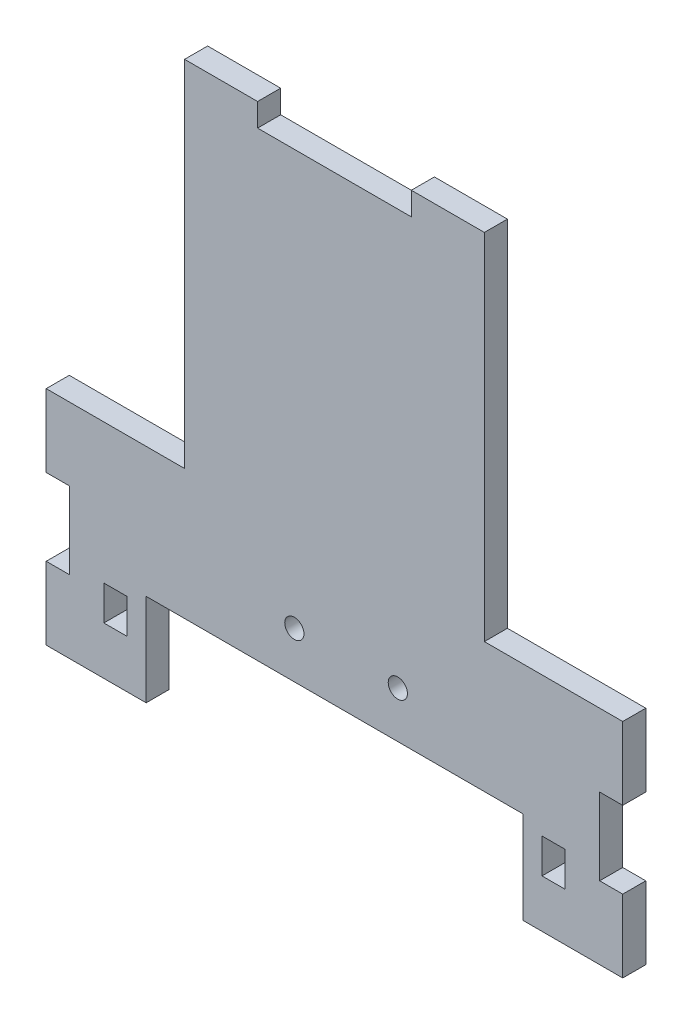
ISO-10303-21;
HEADER;
FILE_DESCRIPTION(('STEP AP214'),'2;1');
FILE_NAME('part.step','',(''),(''),'','','');
FILE_SCHEMA(('AUTOMOTIVE_DESIGN { 1 0 10303 214 1 1 1 1 }'));
ENDSEC;
DATA;
#1=APPLICATION_CONTEXT('core data for automotive mechanical design processes');
#2=APPLICATION_PROTOCOL_DEFINITION('international standard','automotive_design',2000,#1);
#3=PRODUCT_CONTEXT('',#1,'mechanical');
#4=PRODUCT('Part','Part','',(#3));
#5=PRODUCT_RELATED_PRODUCT_CATEGORY('part','',(#4));
#6=PRODUCT_DEFINITION_FORMATION('','',#4);
#7=PRODUCT_DEFINITION_CONTEXT('part definition',#1,'design');
#8=PRODUCT_DEFINITION('design','',#6,#7);
#9=PRODUCT_DEFINITION_SHAPE('','',#8);
#10=(LENGTH_UNIT() NAMED_UNIT(*) SI_UNIT(.MILLI.,.METRE.));
#11=(NAMED_UNIT(*) PLANE_ANGLE_UNIT() SI_UNIT($,.RADIAN.));
#12=(NAMED_UNIT(*) SI_UNIT($,.STERADIAN.) SOLID_ANGLE_UNIT());
#13=UNCERTAINTY_MEASURE_WITH_UNIT(LENGTH_MEASURE(1.E-05),#10,'distance_accuracy_value','');
#14=(GEOMETRIC_REPRESENTATION_CONTEXT(3) GLOBAL_UNCERTAINTY_ASSIGNED_CONTEXT((#13)) GLOBAL_UNIT_ASSIGNED_CONTEXT((#10,
#11,#12)) REPRESENTATION_CONTEXT('',''));
#15=CARTESIAN_POINT('',(0.,0.,0.));
#16=DIRECTION('',(0.,0.,1.));
#17=DIRECTION('',(1.,0.,0.));
#18=AXIS2_PLACEMENT_3D('',#15,#16,#17);
#19=CARTESIAN_POINT('',(75.,0.,3.));
#20=DIRECTION('',(0.,1.,0.));
#21=DIRECTION('',(0.,0.,1.));
#22=AXIS2_PLACEMENT_3D('',#19,#20,#21);
#23=PLANE('',#22);
#24=DIRECTION('',(1.,0.,0.));
#25=VECTOR('',#24,1.);
#26=CARTESIAN_POINT('',(75.,0.,0.));
#27=LINE('',#26,#25);
#28=CARTESIAN_POINT('',(0.,0.,0.));
#29=VERTEX_POINT('',#28);
#30=CARTESIAN_POINT('',(13.,0.,0.));
#31=VERTEX_POINT('',#30);
#32=EDGE_CURVE('E389',#29,#31,#27,.T.);
#33=ORIENTED_EDGE('',*,*,#32,.T.);
#34=DIRECTION('',(0.,0.,1.));
#35=VECTOR('',#34,1.);
#36=CARTESIAN_POINT('',(13.,0.,-7.));
#37=LINE('',#36,#35);
#38=CARTESIAN_POINT('',(13.,0.,3.));
#39=VERTEX_POINT('',#38);
#40=EDGE_CURVE('E331',#31,#39,#37,.T.);
#41=ORIENTED_EDGE('',*,*,#40,.T.);
#42=DIRECTION('',(1.,0.,0.));
#43=VECTOR('',#42,1.);
#44=CARTESIAN_POINT('',(75.,0.,3.));
#45=LINE('',#44,#43);
#46=CARTESIAN_POINT('',(0.,0.,3.));
#47=VERTEX_POINT('',#46);
#48=EDGE_CURVE('E346',#47,#39,#45,.T.);
#49=ORIENTED_EDGE('',*,*,#48,.F.);
#50=DIRECTION('',(0.,0.,-1.));
#51=VECTOR('',#50,1.);
#52=CARTESIAN_POINT('',(0.,0.,3.));
#53=LINE('',#52,#51);
#54=EDGE_CURVE('E483',#47,#29,#53,.T.);
#55=ORIENTED_EDGE('',*,*,#54,.T.);
#56=EDGE_LOOP('',(#33,#41,#49,#55));
#57=FACE_BOUND('',#56,.T.);
#58=ADVANCED_FACE('F33',(#57),#23,.F.);
#59=CARTESIAN_POINT('',(0.,9.45,3.));
#60=DIRECTION('',(1.,0.,0.));
#61=DIRECTION('',(0.,0.,-1.));
#62=AXIS2_PLACEMENT_3D('',#59,#60,#61);
#63=PLANE('',#62);
#64=DIRECTION('',(0.,-1.,0.));
#65=VECTOR('',#64,1.);
#66=CARTESIAN_POINT('',(0.,9.45,0.));
#67=LINE('',#66,#65);
#68=CARTESIAN_POINT('',(0.,9.45,0.));
#69=VERTEX_POINT('',#68);
#70=EDGE_CURVE('E334',#69,#29,#67,.T.);
#71=ORIENTED_EDGE('',*,*,#70,.T.);
#72=ORIENTED_EDGE('',*,*,#54,.F.);
#73=DIRECTION('',(0.,-1.,0.));
#74=VECTOR('',#73,1.);
#75=CARTESIAN_POINT('',(0.,9.45,3.));
#76=LINE('',#75,#74);
#77=CARTESIAN_POINT('',(0.,9.45,3.));
#78=VERTEX_POINT('',#77);
#79=EDGE_CURVE('E341',#78,#47,#76,.T.);
#80=ORIENTED_EDGE('',*,*,#79,.F.);
#81=DIRECTION('',(0.,0.,-1.));
#82=VECTOR('',#81,1.);
#83=CARTESIAN_POINT('',(0.,9.45,3.));
#84=LINE('',#83,#82);
#85=EDGE_CURVE('E385',#78,#69,#84,.T.);
#86=ORIENTED_EDGE('',*,*,#85,.T.);
#87=EDGE_LOOP('',(#71,#72,#80,#86));
#88=FACE_BOUND('',#87,.T.);
#89=ADVANCED_FACE('F35',(#88),#63,.F.);
#90=CARTESIAN_POINT('',(62.,0.,3.));
#91=VERTEX_POINT('',#90);
#92=CARTESIAN_POINT('',(75.,0.,3.));
#93=VERTEX_POINT('',#92);
#94=EDGE_CURVE('E344',#91,#93,#45,.T.);
#95=ORIENTED_EDGE('',*,*,#94,.F.);
#96=DIRECTION('',(0.,0.,1.));
#97=VECTOR('',#96,1.);
#98=CARTESIAN_POINT('',(62.,0.,-7.));
#99=LINE('',#98,#97);
#100=CARTESIAN_POINT('',(62.,0.,0.));
#101=VERTEX_POINT('',#100);
#102=EDGE_CURVE('E337',#101,#91,#99,.T.);
#103=ORIENTED_EDGE('',*,*,#102,.F.);
#104=CARTESIAN_POINT('',(75.,0.,0.));
#105=VERTEX_POINT('',#104);
#106=EDGE_CURVE('E388',#101,#105,#27,.T.);
#107=ORIENTED_EDGE('',*,*,#106,.T.);
#108=DIRECTION('',(0.,0.,-1.));
#109=VECTOR('',#108,1.);
#110=CARTESIAN_POINT('',(75.,0.,3.));
#111=LINE('',#110,#109);
#112=EDGE_CURVE('E480',#93,#105,#111,.T.);
#113=ORIENTED_EDGE('',*,*,#112,.F.);
#114=EDGE_LOOP('',(#95,#103,#107,#113));
#115=FACE_BOUND('',#114,.T.);
#116=ADVANCED_FACE('F503',(#115),#23,.F.);
#117=CARTESIAN_POINT('',(75.,9.45,3.));
#118=DIRECTION('',(-1.,0.,0.));
#119=DIRECTION('',(0.,0.,1.));
#120=AXIS2_PLACEMENT_3D('',#117,#118,#119);
#121=PLANE('',#120);
#122=DIRECTION('',(0.,1.,0.));
#123=VECTOR('',#122,1.);
#124=CARTESIAN_POINT('',(75.,9.45,0.));
#125=LINE('',#124,#123);
#126=CARTESIAN_POINT('',(75.,9.45,0.));
#127=VERTEX_POINT('',#126);
#128=EDGE_CURVE('E392',#105,#127,#125,.T.);
#129=ORIENTED_EDGE('',*,*,#128,.T.);
#130=DIRECTION('',(0.,0.,-1.));
#131=VECTOR('',#130,1.);
#132=CARTESIAN_POINT('',(75.,9.45,3.));
#133=LINE('',#132,#131);
#134=CARTESIAN_POINT('',(75.,9.45,3.));
#135=VERTEX_POINT('',#134);
#136=EDGE_CURVE('E477',#135,#127,#133,.T.);
#137=ORIENTED_EDGE('',*,*,#136,.F.);
#138=DIRECTION('',(0.,1.,0.));
#139=VECTOR('',#138,1.);
#140=CARTESIAN_POINT('',(75.,9.45,3.));
#141=LINE('',#140,#139);
#142=EDGE_CURVE('E349',#93,#135,#141,.T.);
#143=ORIENTED_EDGE('',*,*,#142,.F.);
#144=ORIENTED_EDGE('',*,*,#112,.T.);
#145=EDGE_LOOP('',(#129,#137,#143,#144));
#146=FACE_BOUND('',#145,.T.);
#147=ADVANCED_FACE('F604',(#146),#121,.F.);
#148=CARTESIAN_POINT('',(72.,9.45,3.));
#149=DIRECTION('',(0.,-1.,0.));
#150=DIRECTION('',(0.,0.,-1.));
#151=AXIS2_PLACEMENT_3D('',#148,#149,#150);
#152=PLANE('',#151);
#153=DIRECTION('',(-1.,0.,0.));
#154=VECTOR('',#153,1.);
#155=CARTESIAN_POINT('',(72.,9.45,0.));
#156=LINE('',#155,#154);
#157=CARTESIAN_POINT('',(72.,9.45,0.));
#158=VERTEX_POINT('',#157);
#159=EDGE_CURVE('E394',#127,#158,#156,.T.);
#160=ORIENTED_EDGE('',*,*,#159,.T.);
#161=DIRECTION('',(0.,0.,-1.));
#162=VECTOR('',#161,1.);
#163=CARTESIAN_POINT('',(72.,9.45,3.));
#164=LINE('',#163,#162);
#165=CARTESIAN_POINT('',(72.,9.45,3.));
#166=VERTEX_POINT('',#165);
#167=EDGE_CURVE('E474',#166,#158,#164,.T.);
#168=ORIENTED_EDGE('',*,*,#167,.F.);
#169=DIRECTION('',(-1.,0.,0.));
#170=VECTOR('',#169,1.);
#171=CARTESIAN_POINT('',(72.,9.45,3.));
#172=LINE('',#171,#170);
#173=EDGE_CURVE('E351',#135,#166,#172,.T.);
#174=ORIENTED_EDGE('',*,*,#173,.F.);
#175=ORIENTED_EDGE('',*,*,#136,.T.);
#176=EDGE_LOOP('',(#160,#168,#174,#175));
#177=FACE_BOUND('',#176,.T.);
#178=ADVANCED_FACE('F602',(#177),#152,.F.);
#179=CARTESIAN_POINT('',(72.,19.45,3.));
#180=DIRECTION('',(-1.,0.,0.));
#181=DIRECTION('',(0.,0.,1.));
#182=AXIS2_PLACEMENT_3D('',#179,#180,#181);
#183=PLANE('',#182);
#184=DIRECTION('',(0.,1.,0.));
#185=VECTOR('',#184,1.);
#186=CARTESIAN_POINT('',(72.,19.45,0.));
#187=LINE('',#186,#185);
#188=CARTESIAN_POINT('',(72.,19.45,0.));
#189=VERTEX_POINT('',#188);
#190=EDGE_CURVE('E396',#158,#189,#187,.T.);
#191=ORIENTED_EDGE('',*,*,#190,.T.);
#192=DIRECTION('',(0.,0.,-1.));
#193=VECTOR('',#192,1.);
#194=CARTESIAN_POINT('',(72.,19.45,3.));
#195=LINE('',#194,#193);
#196=CARTESIAN_POINT('',(72.,19.45,3.));
#197=VERTEX_POINT('',#196);
#198=EDGE_CURVE('E471',#197,#189,#195,.T.);
#199=ORIENTED_EDGE('',*,*,#198,.F.);
#200=DIRECTION('',(0.,1.,0.));
#201=VECTOR('',#200,1.);
#202=CARTESIAN_POINT('',(72.,19.45,3.));
#203=LINE('',#202,#201);
#204=EDGE_CURVE('E353',#166,#197,#203,.T.);
#205=ORIENTED_EDGE('',*,*,#204,.F.);
#206=ORIENTED_EDGE('',*,*,#167,.T.);
#207=EDGE_LOOP('',(#191,#199,#205,#206));
#208=FACE_BOUND('',#207,.T.);
#209=ADVANCED_FACE('F598',(#208),#183,.F.);
#210=CARTESIAN_POINT('',(75.,19.45,3.));
#211=DIRECTION('',(0.,1.,0.));
#212=DIRECTION('',(0.,0.,1.));
#213=AXIS2_PLACEMENT_3D('',#210,#211,#212);
#214=PLANE('',#213);
#215=DIRECTION('',(1.,0.,0.));
#216=VECTOR('',#215,1.);
#217=CARTESIAN_POINT('',(75.,19.45,0.));
#218=LINE('',#217,#216);
#219=CARTESIAN_POINT('',(75.,19.45,0.));
#220=VERTEX_POINT('',#219);
#221=EDGE_CURVE('E398',#189,#220,#218,.T.);
#222=ORIENTED_EDGE('',*,*,#221,.T.);
#223=DIRECTION('',(0.,0.,-1.));
#224=VECTOR('',#223,1.);
#225=CARTESIAN_POINT('',(75.,19.45,3.));
#226=LINE('',#225,#224);
#227=CARTESIAN_POINT('',(75.,19.45,3.));
#228=VERTEX_POINT('',#227);
#229=EDGE_CURVE('E468',#228,#220,#226,.T.);
#230=ORIENTED_EDGE('',*,*,#229,.F.);
#231=DIRECTION('',(1.,0.,0.));
#232=VECTOR('',#231,1.);
#233=CARTESIAN_POINT('',(75.,19.45,3.));
#234=LINE('',#233,#232);
#235=EDGE_CURVE('E355',#197,#228,#234,.T.);
#236=ORIENTED_EDGE('',*,*,#235,.F.);
#237=ORIENTED_EDGE('',*,*,#198,.T.);
#238=EDGE_LOOP('',(#222,#230,#236,#237));
#239=FACE_BOUND('',#238,.T.);
#240=ADVANCED_FACE('F593',(#239),#214,.F.);
#241=CARTESIAN_POINT('',(75.,28.9,3.));
#242=DIRECTION('',(-1.,0.,0.));
#243=DIRECTION('',(0.,0.,1.));
#244=AXIS2_PLACEMENT_3D('',#241,#242,#243);
#245=PLANE('',#244);
#246=DIRECTION('',(0.,1.,0.));
#247=VECTOR('',#246,1.);
#248=CARTESIAN_POINT('',(75.,28.9,0.));
#249=LINE('',#248,#247);
#250=CARTESIAN_POINT('',(75.,28.9,0.));
#251=VERTEX_POINT('',#250);
#252=EDGE_CURVE('E400',#220,#251,#249,.T.);
#253=ORIENTED_EDGE('',*,*,#252,.T.);
#254=DIRECTION('',(0.,0.,-1.));
#255=VECTOR('',#254,1.);
#256=CARTESIAN_POINT('',(75.,28.9,3.));
#257=LINE('',#256,#255);
#258=CARTESIAN_POINT('',(75.,28.9,3.));
#259=VERTEX_POINT('',#258);
#260=EDGE_CURVE('E465',#259,#251,#257,.T.);
#261=ORIENTED_EDGE('',*,*,#260,.F.);
#262=DIRECTION('',(0.,1.,0.));
#263=VECTOR('',#262,1.);
#264=CARTESIAN_POINT('',(75.,28.9,3.));
#265=LINE('',#264,#263);
#266=EDGE_CURVE('E357',#228,#259,#265,.T.);
#267=ORIENTED_EDGE('',*,*,#266,.F.);
#268=ORIENTED_EDGE('',*,*,#229,.T.);
#269=EDGE_LOOP('',(#253,#261,#267,#268));
#270=FACE_BOUND('',#269,.T.);
#271=ADVANCED_FACE('F587',(#270),#245,.F.);
#272=CARTESIAN_POINT('',(57.,28.9,3.));
#273=DIRECTION('',(0.,-1.,0.));
#274=DIRECTION('',(0.,0.,-1.));
#275=AXIS2_PLACEMENT_3D('',#272,#273,#274);
#276=PLANE('',#275);
#277=DIRECTION('',(-1.,0.,0.));
#278=VECTOR('',#277,1.);
#279=CARTESIAN_POINT('',(57.,28.9,0.));
#280=LINE('',#279,#278);
#281=CARTESIAN_POINT('',(57.,28.9,0.));
#282=VERTEX_POINT('',#281);
#283=EDGE_CURVE('E402',#251,#282,#280,.T.);
#284=ORIENTED_EDGE('',*,*,#283,.T.);
#285=DIRECTION('',(0.,0.,-1.));
#286=VECTOR('',#285,1.);
#287=CARTESIAN_POINT('',(57.,28.9,3.));
#288=LINE('',#287,#286);
#289=CARTESIAN_POINT('',(57.,28.9,3.));
#290=VERTEX_POINT('',#289);
#291=EDGE_CURVE('E462',#290,#282,#288,.T.);
#292=ORIENTED_EDGE('',*,*,#291,.F.);
#293=DIRECTION('',(-1.,0.,0.));
#294=VECTOR('',#293,1.);
#295=CARTESIAN_POINT('',(57.,28.9,3.));
#296=LINE('',#295,#294);
#297=EDGE_CURVE('E359',#259,#290,#296,.T.);
#298=ORIENTED_EDGE('',*,*,#297,.F.);
#299=ORIENTED_EDGE('',*,*,#260,.T.);
#300=EDGE_LOOP('',(#284,#292,#298,#299));
#301=FACE_BOUND('',#300,.T.);
#302=ADVANCED_FACE('F583',(#301),#276,.F.);
#303=CARTESIAN_POINT('',(57.,75.,3.));
#304=DIRECTION('',(-1.,0.,0.));
#305=DIRECTION('',(0.,-1.,0.));
#306=AXIS2_PLACEMENT_3D('',#303,#304,#305);
#307=PLANE('',#306);
#308=DIRECTION('',(0.,1.,0.));
#309=VECTOR('',#308,1.);
#310=CARTESIAN_POINT('',(57.,75.,0.));
#311=LINE('',#310,#309);
#312=CARTESIAN_POINT('',(57.,75.,0.));
#313=VERTEX_POINT('',#312);
#314=EDGE_CURVE('E404',#282,#313,#311,.T.);
#315=ORIENTED_EDGE('',*,*,#314,.T.);
#316=DIRECTION('',(0.,0.,-1.));
#317=VECTOR('',#316,1.);
#318=CARTESIAN_POINT('',(57.,75.,3.));
#319=LINE('',#318,#317);
#320=CARTESIAN_POINT('',(57.,75.,3.));
#321=VERTEX_POINT('',#320);
#322=EDGE_CURVE('E459',#321,#313,#319,.T.);
#323=ORIENTED_EDGE('',*,*,#322,.F.);
#324=DIRECTION('',(0.,1.,0.));
#325=VECTOR('',#324,1.);
#326=CARTESIAN_POINT('',(57.,75.,3.));
#327=LINE('',#326,#325);
#328=EDGE_CURVE('E361',#290,#321,#327,.T.);
#329=ORIENTED_EDGE('',*,*,#328,.F.);
#330=ORIENTED_EDGE('',*,*,#291,.T.);
#331=EDGE_LOOP('',(#315,#323,#329,#330));
#332=FACE_BOUND('',#331,.T.);
#333=ADVANCED_FACE('F578',(#332),#307,.F.);
#334=CARTESIAN_POINT('',(47.5,75.,3.));
#335=DIRECTION('',(0.,-1.,0.));
#336=DIRECTION('',(0.,0.,-1.));
#337=AXIS2_PLACEMENT_3D('',#334,#335,#336);
#338=PLANE('',#337);
#339=DIRECTION('',(-1.,0.,0.));
#340=VECTOR('',#339,1.);
#341=CARTESIAN_POINT('',(47.5,75.,0.));
#342=LINE('',#341,#340);
#343=CARTESIAN_POINT('',(47.5,75.,0.));
#344=VERTEX_POINT('',#343);
#345=EDGE_CURVE('E406',#313,#344,#342,.T.);
#346=ORIENTED_EDGE('',*,*,#345,.T.);
#347=DIRECTION('',(0.,0.,-1.));
#348=VECTOR('',#347,1.);
#349=CARTESIAN_POINT('',(47.5,75.,3.));
#350=LINE('',#349,#348);
#351=CARTESIAN_POINT('',(47.5,75.,3.));
#352=VERTEX_POINT('',#351);
#353=EDGE_CURVE('E456',#352,#344,#350,.T.);
#354=ORIENTED_EDGE('',*,*,#353,.F.);
#355=DIRECTION('',(-1.,0.,0.));
#356=VECTOR('',#355,1.);
#357=CARTESIAN_POINT('',(47.5,75.,3.));
#358=LINE('',#357,#356);
#359=EDGE_CURVE('E363',#321,#352,#358,.T.);
#360=ORIENTED_EDGE('',*,*,#359,.F.);
#361=ORIENTED_EDGE('',*,*,#322,.T.);
#362=EDGE_LOOP('',(#346,#354,#360,#361));
#363=FACE_BOUND('',#362,.T.);
#364=ADVANCED_FACE('F572',(#363),#338,.F.);
#365=CARTESIAN_POINT('',(47.5,72.,3.));
#366=DIRECTION('',(1.,0.,0.));
#367=DIRECTION('',(0.,0.,-1.));
#368=AXIS2_PLACEMENT_3D('',#365,#366,#367);
#369=PLANE('',#368);
#370=DIRECTION('',(0.,-1.,0.));
#371=VECTOR('',#370,1.);
#372=CARTESIAN_POINT('',(47.5,72.,0.));
#373=LINE('',#372,#371);
#374=CARTESIAN_POINT('',(47.5,72.,0.));
#375=VERTEX_POINT('',#374);
#376=EDGE_CURVE('E408',#344,#375,#373,.T.);
#377=ORIENTED_EDGE('',*,*,#376,.T.);
#378=DIRECTION('',(0.,0.,-1.));
#379=VECTOR('',#378,1.);
#380=CARTESIAN_POINT('',(47.5,72.,3.));
#381=LINE('',#380,#379);
#382=CARTESIAN_POINT('',(47.5,72.,3.));
#383=VERTEX_POINT('',#382);
#384=EDGE_CURVE('E453',#383,#375,#381,.T.);
#385=ORIENTED_EDGE('',*,*,#384,.F.);
#386=DIRECTION('',(0.,-1.,0.));
#387=VECTOR('',#386,1.);
#388=CARTESIAN_POINT('',(47.5,72.,3.));
#389=LINE('',#388,#387);
#390=EDGE_CURVE('E365',#352,#383,#389,.T.);
#391=ORIENTED_EDGE('',*,*,#390,.F.);
#392=ORIENTED_EDGE('',*,*,#353,.T.);
#393=EDGE_LOOP('',(#377,#385,#391,#392));
#394=FACE_BOUND('',#393,.T.);
#395=ADVANCED_FACE('F568',(#394),#369,.F.);
#396=CARTESIAN_POINT('',(27.5,72.,3.));
#397=DIRECTION('',(0.,-1.,0.));
#398=DIRECTION('',(0.,0.,-1.));
#399=AXIS2_PLACEMENT_3D('',#396,#397,#398);
#400=PLANE('',#399);
#401=DIRECTION('',(-1.,0.,0.));
#402=VECTOR('',#401,1.);
#403=CARTESIAN_POINT('',(27.5,72.,0.));
#404=LINE('',#403,#402);
#405=CARTESIAN_POINT('',(27.5,72.,0.));
#406=VERTEX_POINT('',#405);
#407=EDGE_CURVE('E410',#375,#406,#404,.T.);
#408=ORIENTED_EDGE('',*,*,#407,.T.);
#409=DIRECTION('',(0.,0.,-1.));
#410=VECTOR('',#409,1.);
#411=CARTESIAN_POINT('',(27.5,72.,3.));
#412=LINE('',#411,#410);
#413=CARTESIAN_POINT('',(27.5,72.,3.));
#414=VERTEX_POINT('',#413);
#415=EDGE_CURVE('E450',#414,#406,#412,.T.);
#416=ORIENTED_EDGE('',*,*,#415,.F.);
#417=DIRECTION('',(-1.,0.,0.));
#418=VECTOR('',#417,1.);
#419=CARTESIAN_POINT('',(27.5,72.,3.));
#420=LINE('',#419,#418);
#421=EDGE_CURVE('E367',#383,#414,#420,.T.);
#422=ORIENTED_EDGE('',*,*,#421,.F.);
#423=ORIENTED_EDGE('',*,*,#384,.T.);
#424=EDGE_LOOP('',(#408,#416,#422,#423));
#425=FACE_BOUND('',#424,.T.);
#426=ADVANCED_FACE('F563',(#425),#400,.F.);
#427=CARTESIAN_POINT('',(27.5,75.,3.));
#428=DIRECTION('',(-1.,0.,0.));
#429=DIRECTION('',(0.,0.,1.));
#430=AXIS2_PLACEMENT_3D('',#427,#428,#429);
#431=PLANE('',#430);
#432=DIRECTION('',(0.,1.,0.));
#433=VECTOR('',#432,1.);
#434=CARTESIAN_POINT('',(27.5,75.,0.));
#435=LINE('',#434,#433);
#436=CARTESIAN_POINT('',(27.5,75.,0.));
#437=VERTEX_POINT('',#436);
#438=EDGE_CURVE('E412',#406,#437,#435,.T.);
#439=ORIENTED_EDGE('',*,*,#438,.T.);
#440=DIRECTION('',(0.,0.,-1.));
#441=VECTOR('',#440,1.);
#442=CARTESIAN_POINT('',(27.5,75.,3.));
#443=LINE('',#442,#441);
#444=CARTESIAN_POINT('',(27.5,75.,3.));
#445=VERTEX_POINT('',#444);
#446=EDGE_CURVE('E447',#445,#437,#443,.T.);
#447=ORIENTED_EDGE('',*,*,#446,.F.);
#448=DIRECTION('',(0.,1.,0.));
#449=VECTOR('',#448,1.);
#450=CARTESIAN_POINT('',(27.5,75.,3.));
#451=LINE('',#450,#449);
#452=EDGE_CURVE('E369',#414,#445,#451,.T.);
#453=ORIENTED_EDGE('',*,*,#452,.F.);
#454=ORIENTED_EDGE('',*,*,#415,.T.);
#455=EDGE_LOOP('',(#439,#447,#453,#454));
#456=FACE_BOUND('',#455,.T.);
#457=ADVANCED_FACE('F557',(#456),#431,.F.);
#458=CARTESIAN_POINT('',(18.,75.,3.));
#459=DIRECTION('',(0.,-1.,0.));
#460=DIRECTION('',(0.,0.,-1.));
#461=AXIS2_PLACEMENT_3D('',#458,#459,#460);
#462=PLANE('',#461);
#463=DIRECTION('',(-1.,0.,0.));
#464=VECTOR('',#463,1.);
#465=CARTESIAN_POINT('',(18.,75.,0.));
#466=LINE('',#465,#464);
#467=CARTESIAN_POINT('',(18.,75.,0.));
#468=VERTEX_POINT('',#467);
#469=EDGE_CURVE('E414',#437,#468,#466,.T.);
#470=ORIENTED_EDGE('',*,*,#469,.T.);
#471=DIRECTION('',(0.,0.,-1.));
#472=VECTOR('',#471,1.);
#473=CARTESIAN_POINT('',(18.,75.,3.));
#474=LINE('',#473,#472);
#475=CARTESIAN_POINT('',(18.,75.,3.));
#476=VERTEX_POINT('',#475);
#477=EDGE_CURVE('E444',#476,#468,#474,.T.);
#478=ORIENTED_EDGE('',*,*,#477,.F.);
#479=DIRECTION('',(-1.,0.,0.));
#480=VECTOR('',#479,1.);
#481=CARTESIAN_POINT('',(18.,75.,3.));
#482=LINE('',#481,#480);
#483=EDGE_CURVE('E371',#445,#476,#482,.T.);
#484=ORIENTED_EDGE('',*,*,#483,.F.);
#485=ORIENTED_EDGE('',*,*,#446,.T.);
#486=EDGE_LOOP('',(#470,#478,#484,#485));
#487=FACE_BOUND('',#486,.T.);
#488=ADVANCED_FACE('F553',(#487),#462,.F.);
#489=CARTESIAN_POINT('',(18.,28.9,3.));
#490=DIRECTION('',(1.,0.,0.));
#491=DIRECTION('',(0.,0.,-1.));
#492=AXIS2_PLACEMENT_3D('',#489,#490,#491);
#493=PLANE('',#492);
#494=DIRECTION('',(0.,-1.,0.));
#495=VECTOR('',#494,1.);
#496=CARTESIAN_POINT('',(18.,28.9,0.));
#497=LINE('',#496,#495);
#498=CARTESIAN_POINT('',(18.,28.9,0.));
#499=VERTEX_POINT('',#498);
#500=EDGE_CURVE('E416',#468,#499,#497,.T.);
#501=ORIENTED_EDGE('',*,*,#500,.T.);
#502=DIRECTION('',(0.,0.,-1.));
#503=VECTOR('',#502,1.);
#504=CARTESIAN_POINT('',(18.,28.9,3.));
#505=LINE('',#504,#503);
#506=CARTESIAN_POINT('',(18.,28.9,3.));
#507=VERTEX_POINT('',#506);
#508=EDGE_CURVE('E441',#507,#499,#505,.T.);
#509=ORIENTED_EDGE('',*,*,#508,.F.);
#510=DIRECTION('',(0.,-1.,0.));
#511=VECTOR('',#510,1.);
#512=CARTESIAN_POINT('',(18.,28.9,3.));
#513=LINE('',#512,#511);
#514=EDGE_CURVE('E373',#476,#507,#513,.T.);
#515=ORIENTED_EDGE('',*,*,#514,.F.);
#516=ORIENTED_EDGE('',*,*,#477,.T.);
#517=EDGE_LOOP('',(#501,#509,#515,#516));
#518=FACE_BOUND('',#517,.T.);
#519=ADVANCED_FACE('F548',(#518),#493,.F.);
#520=CARTESIAN_POINT('',(0.,28.9,3.));
#521=DIRECTION('',(0.,-1.,0.));
#522=DIRECTION('',(0.,0.,-1.));
#523=AXIS2_PLACEMENT_3D('',#520,#521,#522);
#524=PLANE('',#523);
#525=DIRECTION('',(-1.,0.,0.));
#526=VECTOR('',#525,1.);
#527=CARTESIAN_POINT('',(0.,28.9,0.));
#528=LINE('',#527,#526);
#529=CARTESIAN_POINT('',(0.,28.9,0.));
#530=VERTEX_POINT('',#529);
#531=EDGE_CURVE('E418',#499,#530,#528,.T.);
#532=ORIENTED_EDGE('',*,*,#531,.T.);
#533=DIRECTION('',(0.,0.,-1.));
#534=VECTOR('',#533,1.);
#535=CARTESIAN_POINT('',(0.,28.9,3.));
#536=LINE('',#535,#534);
#537=CARTESIAN_POINT('',(0.,28.9,3.));
#538=VERTEX_POINT('',#537);
#539=EDGE_CURVE('E438',#538,#530,#536,.T.);
#540=ORIENTED_EDGE('',*,*,#539,.F.);
#541=DIRECTION('',(-1.,0.,0.));
#542=VECTOR('',#541,1.);
#543=CARTESIAN_POINT('',(0.,28.9,3.));
#544=LINE('',#543,#542);
#545=EDGE_CURVE('E375',#507,#538,#544,.T.);
#546=ORIENTED_EDGE('',*,*,#545,.F.);
#547=ORIENTED_EDGE('',*,*,#508,.T.);
#548=EDGE_LOOP('',(#532,#540,#546,#547));
#549=FACE_BOUND('',#548,.T.);
#550=ADVANCED_FACE('F542',(#549),#524,.F.);
#551=CARTESIAN_POINT('',(0.,28.9,3.));
#552=DIRECTION('',(1.,0.,0.));
#553=DIRECTION('',(0.,0.,-1.));
#554=AXIS2_PLACEMENT_3D('',#551,#552,#553);
#555=PLANE('',#554);
#556=DIRECTION('',(0.,-1.,0.));
#557=VECTOR('',#556,1.);
#558=CARTESIAN_POINT('',(0.,28.9,0.));
#559=LINE('',#558,#557);
#560=CARTESIAN_POINT('',(0.,19.45,0.));
#561=VERTEX_POINT('',#560);
#562=EDGE_CURVE('E420',#530,#561,#559,.T.);
#563=ORIENTED_EDGE('',*,*,#562,.T.);
#564=DIRECTION('',(0.,0.,-1.));
#565=VECTOR('',#564,1.);
#566=CARTESIAN_POINT('',(0.,19.45,3.));
#567=LINE('',#566,#565);
#568=CARTESIAN_POINT('',(0.,19.45,3.));
#569=VERTEX_POINT('',#568);
#570=EDGE_CURVE('E435',#569,#561,#567,.T.);
#571=ORIENTED_EDGE('',*,*,#570,.F.);
#572=DIRECTION('',(0.,-1.,0.));
#573=VECTOR('',#572,1.);
#574=CARTESIAN_POINT('',(0.,28.9,3.));
#575=LINE('',#574,#573);
#576=EDGE_CURVE('E377',#538,#569,#575,.T.);
#577=ORIENTED_EDGE('',*,*,#576,.F.);
#578=ORIENTED_EDGE('',*,*,#539,.T.);
#579=EDGE_LOOP('',(#563,#571,#577,#578));
#580=FACE_BOUND('',#579,.T.);
#581=ADVANCED_FACE('F538',(#580),#555,.F.);
#582=CARTESIAN_POINT('',(0.,19.45,3.));
#583=DIRECTION('',(0.,1.,0.));
#584=DIRECTION('',(0.,0.,1.));
#585=AXIS2_PLACEMENT_3D('',#582,#583,#584);
#586=PLANE('',#585);
#587=DIRECTION('',(1.,0.,0.));
#588=VECTOR('',#587,1.);
#589=CARTESIAN_POINT('',(0.,19.45,0.));
#590=LINE('',#589,#588);
#591=CARTESIAN_POINT('',(3.,19.45,0.));
#592=VERTEX_POINT('',#591);
#593=EDGE_CURVE('E422',#561,#592,#590,.T.);
#594=ORIENTED_EDGE('',*,*,#593,.T.);
#595=DIRECTION('',(0.,0.,-1.));
#596=VECTOR('',#595,1.);
#597=CARTESIAN_POINT('',(3.,19.45,3.));
#598=LINE('',#597,#596);
#599=CARTESIAN_POINT('',(3.,19.45,3.));
#600=VERTEX_POINT('',#599);
#601=EDGE_CURVE('E432',#600,#592,#598,.T.);
#602=ORIENTED_EDGE('',*,*,#601,.F.);
#603=DIRECTION('',(1.,0.,0.));
#604=VECTOR('',#603,1.);
#605=CARTESIAN_POINT('',(0.,19.45,3.));
#606=LINE('',#605,#604);
#607=EDGE_CURVE('E379',#569,#600,#606,.T.);
#608=ORIENTED_EDGE('',*,*,#607,.F.);
#609=ORIENTED_EDGE('',*,*,#570,.T.);
#610=EDGE_LOOP('',(#594,#602,#608,#609));
#611=FACE_BOUND('',#610,.T.);
#612=ADVANCED_FACE('F533',(#611),#586,.F.);
#613=CARTESIAN_POINT('',(3.,19.45,3.));
#614=DIRECTION('',(1.,0.,0.));
#615=DIRECTION('',(0.,0.,-1.));
#616=AXIS2_PLACEMENT_3D('',#613,#614,#615);
#617=PLANE('',#616);
#618=DIRECTION('',(0.,-1.,0.));
#619=VECTOR('',#618,1.);
#620=CARTESIAN_POINT('',(3.,19.45,0.));
#621=LINE('',#620,#619);
#622=CARTESIAN_POINT('',(3.,9.45,0.));
#623=VERTEX_POINT('',#622);
#624=EDGE_CURVE('E424',#592,#623,#621,.T.);
#625=ORIENTED_EDGE('',*,*,#624,.T.);
#626=DIRECTION('',(0.,0.,-1.));
#627=VECTOR('',#626,1.);
#628=CARTESIAN_POINT('',(3.,9.45,3.));
#629=LINE('',#628,#627);
#630=CARTESIAN_POINT('',(3.,9.45,3.));
#631=VERTEX_POINT('',#630);
#632=EDGE_CURVE('E429',#631,#623,#629,.T.);
#633=ORIENTED_EDGE('',*,*,#632,.F.);
#634=DIRECTION('',(0.,-1.,0.));
#635=VECTOR('',#634,1.);
#636=CARTESIAN_POINT('',(3.,19.45,3.));
#637=LINE('',#636,#635);
#638=EDGE_CURVE('E381',#600,#631,#637,.T.);
#639=ORIENTED_EDGE('',*,*,#638,.F.);
#640=ORIENTED_EDGE('',*,*,#601,.T.);
#641=EDGE_LOOP('',(#625,#633,#639,#640));
#642=FACE_BOUND('',#641,.T.);
#643=ADVANCED_FACE('F527',(#642),#617,.F.);
#644=CARTESIAN_POINT('',(3.,9.45,3.));
#645=DIRECTION('',(0.,-1.,0.));
#646=DIRECTION('',(1.,0.,0.));
#647=AXIS2_PLACEMENT_3D('',#644,#645,#646);
#648=PLANE('',#647);
#649=DIRECTION('',(-1.,0.,0.));
#650=VECTOR('',#649,1.);
#651=CARTESIAN_POINT('',(3.,9.45,0.));
#652=LINE('',#651,#650);
#653=EDGE_CURVE('E345',#623,#69,#652,.T.);
#654=ORIENTED_EDGE('',*,*,#653,.T.);
#655=ORIENTED_EDGE('',*,*,#85,.F.);
#656=DIRECTION('',(-1.,0.,0.));
#657=VECTOR('',#656,1.);
#658=CARTESIAN_POINT('',(3.,9.45,3.));
#659=LINE('',#658,#657);
#660=EDGE_CURVE('E383',#631,#78,#659,.T.);
#661=ORIENTED_EDGE('',*,*,#660,.F.);
#662=ORIENTED_EDGE('',*,*,#632,.T.);
#663=EDGE_LOOP('',(#654,#655,#661,#662));
#664=FACE_BOUND('',#663,.T.);
#665=ADVANCED_FACE('F523',(#664),#648,.F.);
#666=CARTESIAN_POINT('',(0.,0.,3.));
#667=DIRECTION('',(0.,0.,-1.));
#668=DIRECTION('',(-1.,0.,0.));
#669=AXIS2_PLACEMENT_3D('',#666,#667,#668);
#670=PLANE('',#669);
#671=DIRECTION('',(-1.,0.,0.));
#672=VECTOR('',#671,1.);
#673=CARTESIAN_POINT('',(0.,6.25,3.));
#674=LINE('',#673,#672);
#675=CARTESIAN_POINT('',(10.5,6.25,3.));
#676=VERTEX_POINT('',#675);
#677=CARTESIAN_POINT('',(7.5,6.25,3.));
#678=VERTEX_POINT('',#677);
#679=EDGE_CURVE('E305',#676,#678,#674,.T.);
#680=ORIENTED_EDGE('',*,*,#679,.T.);
#681=DIRECTION('',(0.,1.,0.));
#682=VECTOR('',#681,1.);
#683=CARTESIAN_POINT('',(7.5,0.,3.));
#684=LINE('',#683,#682);
#685=CARTESIAN_POINT('',(7.5,10.75,3.));
#686=VERTEX_POINT('',#685);
#687=EDGE_CURVE('E308',#678,#686,#684,.T.);
#688=ORIENTED_EDGE('',*,*,#687,.T.);
#689=DIRECTION('',(1.,0.,0.));
#690=VECTOR('',#689,1.);
#691=CARTESIAN_POINT('',(0.,10.75,3.));
#692=LINE('',#691,#690);
#693=CARTESIAN_POINT('',(10.5,10.75,3.));
#694=VERTEX_POINT('',#693);
#695=EDGE_CURVE('E302',#686,#694,#692,.T.);
#696=ORIENTED_EDGE('',*,*,#695,.T.);
#697=DIRECTION('',(0.,-1.,0.));
#698=VECTOR('',#697,1.);
#699=CARTESIAN_POINT('',(10.5,0.,3.));
#700=LINE('',#699,#698);
#701=EDGE_CURVE('E246',#694,#676,#700,.T.);
#702=ORIENTED_EDGE('',*,*,#701,.T.);
#703=EDGE_LOOP('',(#680,#688,#696,#702));
#704=FACE_BOUND('',#703,.T.);
#705=DIRECTION('',(-1.,0.,0.));
#706=VECTOR('',#705,1.);
#707=CARTESIAN_POINT('',(0.,6.25,3.));
#708=LINE('',#707,#706);
#709=CARTESIAN_POINT('',(67.5,6.25,3.));
#710=VERTEX_POINT('',#709);
#711=CARTESIAN_POINT('',(64.5,6.25,3.));
#712=VERTEX_POINT('',#711);
#713=EDGE_CURVE('E296',#710,#712,#708,.T.);
#714=ORIENTED_EDGE('',*,*,#713,.T.);
#715=DIRECTION('',(0.,1.,0.));
#716=VECTOR('',#715,1.);
#717=CARTESIAN_POINT('',(64.5,0.,3.));
#718=LINE('',#717,#716);
#719=CARTESIAN_POINT('',(64.5,10.75,3.));
#720=VERTEX_POINT('',#719);
#721=EDGE_CURVE('E299',#712,#720,#718,.T.);
#722=ORIENTED_EDGE('',*,*,#721,.T.);
#723=DIRECTION('',(1.,0.,0.));
#724=VECTOR('',#723,1.);
#725=CARTESIAN_POINT('',(0.,10.75,3.));
#726=LINE('',#725,#724);
#727=CARTESIAN_POINT('',(67.5,10.75,3.));
#728=VERTEX_POINT('',#727);
#729=EDGE_CURVE('E270',#720,#728,#726,.T.);
#730=ORIENTED_EDGE('',*,*,#729,.T.);
#731=DIRECTION('',(0.,-1.,0.));
#732=VECTOR('',#731,1.);
#733=CARTESIAN_POINT('',(67.5,0.,3.));
#734=LINE('',#733,#732);
#735=EDGE_CURVE('E293',#728,#710,#734,.T.);
#736=ORIENTED_EDGE('',*,*,#735,.T.);
#737=EDGE_LOOP('',(#714,#722,#730,#736));
#738=FACE_BOUND('',#737,.T.);
#739=CARTESIAN_POINT('',(32.2797399014283,18.0333319427727,3.));
#740=DIRECTION('',(0.,0.,-1.));
#741=DIRECTION('',(-1.,0.,0.));
#742=AXIS2_PLACEMENT_3D('',#739,#740,#741);
#743=CIRCLE('',#742,1.25);
#744=CARTESIAN_POINT('',(31.0297399014283,18.0333319427727,3.));
#745=VERTEX_POINT('',#744);
#746=EDGE_CURVE('E320',#745,#745,#743,.T.);
#747=ORIENTED_EDGE('',*,*,#746,.T.);
#748=EDGE_LOOP('',(#747));
#749=FACE_BOUND('',#748,.T.);
#750=CARTESIAN_POINT('',(45.7417399014284,18.0333319427718,3.));
#751=DIRECTION('',(0.,0.,-1.));
#752=DIRECTION('',(-1.,0.,0.));
#753=AXIS2_PLACEMENT_3D('',#750,#751,#752);
#754=CIRCLE('',#753,1.25);
#755=CARTESIAN_POINT('',(44.4917399014284,18.0333319427718,3.));
#756=VERTEX_POINT('',#755);
#757=EDGE_CURVE('E315',#756,#756,#754,.T.);
#758=ORIENTED_EDGE('',*,*,#757,.T.);
#759=EDGE_LOOP('',(#758));
#760=FACE_BOUND('',#759,.T.);
#761=ORIENTED_EDGE('',*,*,#48,.T.);
#762=DIRECTION('',(0.,-1.,0.));
#763=VECTOR('',#762,1.);
#764=CARTESIAN_POINT('',(13.,0.,3.));
#765=LINE('',#764,#763);
#766=CARTESIAN_POINT('',(13.,12.,3.));
#767=VERTEX_POINT('',#766);
#768=EDGE_CURVE('E323',#767,#39,#765,.T.);
#769=ORIENTED_EDGE('',*,*,#768,.F.);
#770=DIRECTION('',(-1.,0.,0.));
#771=VECTOR('',#770,1.);
#772=CARTESIAN_POINT('',(13.,12.,3.));
#773=LINE('',#772,#771);
#774=CARTESIAN_POINT('',(62.,12.,3.));
#775=VERTEX_POINT('',#774);
#776=EDGE_CURVE('E328',#775,#767,#773,.T.);
#777=ORIENTED_EDGE('',*,*,#776,.F.);
#778=DIRECTION('',(0.,1.,0.));
#779=VECTOR('',#778,1.);
#780=CARTESIAN_POINT('',(62.,0.,3.));
#781=LINE('',#780,#779);
#782=EDGE_CURVE('E325',#91,#775,#781,.T.);
#783=ORIENTED_EDGE('',*,*,#782,.F.);
#784=ORIENTED_EDGE('',*,*,#94,.T.);
#785=ORIENTED_EDGE('',*,*,#142,.T.);
#786=ORIENTED_EDGE('',*,*,#173,.T.);
#787=ORIENTED_EDGE('',*,*,#204,.T.);
#788=ORIENTED_EDGE('',*,*,#235,.T.);
#789=ORIENTED_EDGE('',*,*,#266,.T.);
#790=ORIENTED_EDGE('',*,*,#297,.T.);
#791=ORIENTED_EDGE('',*,*,#328,.T.);
#792=ORIENTED_EDGE('',*,*,#359,.T.);
#793=ORIENTED_EDGE('',*,*,#390,.T.);
#794=ORIENTED_EDGE('',*,*,#421,.T.);
#795=ORIENTED_EDGE('',*,*,#452,.T.);
#796=ORIENTED_EDGE('',*,*,#483,.T.);
#797=ORIENTED_EDGE('',*,*,#514,.T.);
#798=ORIENTED_EDGE('',*,*,#545,.T.);
#799=ORIENTED_EDGE('',*,*,#576,.T.);
#800=ORIENTED_EDGE('',*,*,#607,.T.);
#801=ORIENTED_EDGE('',*,*,#638,.T.);
#802=ORIENTED_EDGE('',*,*,#660,.T.);
#803=ORIENTED_EDGE('',*,*,#79,.T.);
#804=EDGE_LOOP('',(#761,#769,#777,#783,#784,#785,#786,#787,#788,#789,#790,#791,#792,#793,#794,
#795,#796,#797,#798,#799,#800,#801,#802,#803));
#805=FACE_BOUND('',#804,.T.);
#806=ADVANCED_FACE('F507',(#704,#738,#749,#760,#805),#670,.F.);
#807=CARTESIAN_POINT('',(0.,0.,0.));
#808=DIRECTION('',(0.,0.,-1.));
#809=DIRECTION('',(-1.,0.,0.));
#810=AXIS2_PLACEMENT_3D('',#807,#808,#809);
#811=PLANE('',#810);
#812=DIRECTION('',(0.,1.,0.));
#813=VECTOR('',#812,1.);
#814=CARTESIAN_POINT('',(7.5,6.25,0.));
#815=LINE('',#814,#813);
#816=CARTESIAN_POINT('',(7.5,6.25,0.));
#817=VERTEX_POINT('',#816);
#818=CARTESIAN_POINT('',(7.5,10.75,0.));
#819=VERTEX_POINT('',#818);
#820=EDGE_CURVE('E258',#817,#819,#815,.T.);
#821=ORIENTED_EDGE('',*,*,#820,.F.);
#822=DIRECTION('',(-1.,0.,0.));
#823=VECTOR('',#822,1.);
#824=CARTESIAN_POINT('',(7.5,6.25,0.));
#825=LINE('',#824,#823);
#826=CARTESIAN_POINT('',(10.5,6.25,0.));
#827=VERTEX_POINT('',#826);
#828=EDGE_CURVE('E263',#827,#817,#825,.T.);
#829=ORIENTED_EDGE('',*,*,#828,.F.);
#830=DIRECTION('',(0.,-1.,0.));
#831=VECTOR('',#830,1.);
#832=CARTESIAN_POINT('',(10.5,6.25,0.));
#833=LINE('',#832,#831);
#834=CARTESIAN_POINT('',(10.5,10.75,0.));
#835=VERTEX_POINT('',#834);
#836=EDGE_CURVE('E243',#835,#827,#833,.T.);
#837=ORIENTED_EDGE('',*,*,#836,.F.);
#838=DIRECTION('',(1.,0.,0.));
#839=VECTOR('',#838,1.);
#840=CARTESIAN_POINT('',(7.5,10.75,0.));
#841=LINE('',#840,#839);
#842=EDGE_CURVE('E253',#819,#835,#841,.T.);
#843=ORIENTED_EDGE('',*,*,#842,.F.);
#844=EDGE_LOOP('',(#821,#829,#837,#843));
#845=FACE_BOUND('',#844,.T.);
#846=DIRECTION('',(0.,1.,0.));
#847=VECTOR('',#846,1.);
#848=CARTESIAN_POINT('',(64.5,6.25,0.));
#849=LINE('',#848,#847);
#850=CARTESIAN_POINT('',(64.5,6.25,0.));
#851=VERTEX_POINT('',#850);
#852=CARTESIAN_POINT('',(64.5,10.75,0.));
#853=VERTEX_POINT('',#852);
#854=EDGE_CURVE('E273',#851,#853,#849,.T.);
#855=ORIENTED_EDGE('',*,*,#854,.F.);
#856=DIRECTION('',(-1.,0.,0.));
#857=VECTOR('',#856,1.);
#858=CARTESIAN_POINT('',(64.5,6.25,0.));
#859=LINE('',#858,#857);
#860=CARTESIAN_POINT('',(67.5,6.25,0.));
#861=VERTEX_POINT('',#860);
#862=EDGE_CURVE('E280',#861,#851,#859,.T.);
#863=ORIENTED_EDGE('',*,*,#862,.F.);
#864=DIRECTION('',(0.,-1.,0.));
#865=VECTOR('',#864,1.);
#866=CARTESIAN_POINT('',(67.5,6.25,0.));
#867=LINE('',#866,#865);
#868=CARTESIAN_POINT('',(67.5,10.75,0.));
#869=VERTEX_POINT('',#868);
#870=EDGE_CURVE('E277',#869,#861,#867,.T.);
#871=ORIENTED_EDGE('',*,*,#870,.F.);
#872=DIRECTION('',(1.,0.,0.));
#873=VECTOR('',#872,1.);
#874=CARTESIAN_POINT('',(64.5,10.75,0.));
#875=LINE('',#874,#873);
#876=EDGE_CURVE('E275',#853,#869,#875,.T.);
#877=ORIENTED_EDGE('',*,*,#876,.F.);
#878=EDGE_LOOP('',(#855,#863,#871,#877));
#879=FACE_BOUND('',#878,.T.);
#880=CARTESIAN_POINT('',(32.2797399014283,18.0333319427727,0.));
#881=DIRECTION('',(0.,0.,-1.));
#882=DIRECTION('',(-1.,0.,0.));
#883=AXIS2_PLACEMENT_3D('',#880,#881,#882);
#884=CIRCLE('',#883,1.25);
#885=CARTESIAN_POINT('',(31.0297399014283,18.0333319427727,0.));
#886=VERTEX_POINT('',#885);
#887=EDGE_CURVE('E312',#886,#886,#884,.T.);
#888=ORIENTED_EDGE('',*,*,#887,.F.);
#889=EDGE_LOOP('',(#888));
#890=FACE_BOUND('',#889,.T.);
#891=CARTESIAN_POINT('',(45.7417399014284,18.0333319427718,0.));
#892=DIRECTION('',(0.,0.,-1.));
#893=DIRECTION('',(-1.,0.,0.));
#894=AXIS2_PLACEMENT_3D('',#891,#892,#893);
#895=CIRCLE('',#894,1.25);
#896=CARTESIAN_POINT('',(44.4917399014284,18.0333319427718,0.));
#897=VERTEX_POINT('',#896);
#898=EDGE_CURVE('E311',#897,#897,#895,.T.);
#899=ORIENTED_EDGE('',*,*,#898,.F.);
#900=EDGE_LOOP('',(#899));
#901=FACE_BOUND('',#900,.T.);
#902=DIRECTION('',(0.,1.,0.));
#903=VECTOR('',#902,1.);
#904=CARTESIAN_POINT('',(13.,0.,0.));
#905=LINE('',#904,#903);
#906=CARTESIAN_POINT('',(13.,12.,0.));
#907=VERTEX_POINT('',#906);
#908=EDGE_CURVE('E11',#31,#907,#905,.T.);
#909=ORIENTED_EDGE('',*,*,#908,.F.);
#910=ORIENTED_EDGE('',*,*,#32,.F.);
#911=ORIENTED_EDGE('',*,*,#70,.F.);
#912=ORIENTED_EDGE('',*,*,#653,.F.);
#913=ORIENTED_EDGE('',*,*,#624,.F.);
#914=ORIENTED_EDGE('',*,*,#593,.F.);
#915=ORIENTED_EDGE('',*,*,#562,.F.);
#916=ORIENTED_EDGE('',*,*,#531,.F.);
#917=ORIENTED_EDGE('',*,*,#500,.F.);
#918=ORIENTED_EDGE('',*,*,#469,.F.);
#919=ORIENTED_EDGE('',*,*,#438,.F.);
#920=ORIENTED_EDGE('',*,*,#407,.F.);
#921=ORIENTED_EDGE('',*,*,#376,.F.);
#922=ORIENTED_EDGE('',*,*,#345,.F.);
#923=ORIENTED_EDGE('',*,*,#314,.F.);
#924=ORIENTED_EDGE('',*,*,#283,.F.);
#925=ORIENTED_EDGE('',*,*,#252,.F.);
#926=ORIENTED_EDGE('',*,*,#221,.F.);
#927=ORIENTED_EDGE('',*,*,#190,.F.);
#928=ORIENTED_EDGE('',*,*,#159,.F.);
#929=ORIENTED_EDGE('',*,*,#128,.F.);
#930=ORIENTED_EDGE('',*,*,#106,.F.);
#931=DIRECTION('',(0.,-1.,0.));
#932=VECTOR('',#931,1.);
#933=CARTESIAN_POINT('',(62.,0.,0.));
#934=LINE('',#933,#932);
#935=CARTESIAN_POINT('',(62.,12.,0.));
#936=VERTEX_POINT('',#935);
#937=EDGE_CURVE('E486',#936,#101,#934,.T.);
#938=ORIENTED_EDGE('',*,*,#937,.F.);
#939=DIRECTION('',(1.,0.,0.));
#940=VECTOR('',#939,1.);
#941=CARTESIAN_POINT('',(0.,12.,0.));
#942=LINE('',#941,#940);
#943=EDGE_CURVE('E41',#907,#936,#942,.T.);
#944=ORIENTED_EDGE('',*,*,#943,.F.);
#945=EDGE_LOOP('',(#909,#910,#911,#912,#913,#914,#915,#916,#917,#918,#919,#920,#921,#922,#923,
#924,#925,#926,#927,#928,#929,#930,#938,#944));
#946=FACE_BOUND('',#945,.T.);
#947=ADVANCED_FACE('F260',(#845,#879,#890,#901,#946),#811,.T.);
#948=CARTESIAN_POINT('',(13.,0.,-7.));
#949=DIRECTION('',(-1.,0.,0.));
#950=DIRECTION('',(0.,0.,1.));
#951=AXIS2_PLACEMENT_3D('',#948,#949,#950);
#952=PLANE('',#951);
#953=ORIENTED_EDGE('',*,*,#908,.T.);
#954=DIRECTION('',(0.,0.,1.));
#955=VECTOR('',#954,1.);
#956=CARTESIAN_POINT('',(13.,12.,-7.));
#957=LINE('',#956,#955);
#958=EDGE_CURVE('E332',#907,#767,#957,.T.);
#959=ORIENTED_EDGE('',*,*,#958,.T.);
#960=ORIENTED_EDGE('',*,*,#768,.T.);
#961=ORIENTED_EDGE('',*,*,#40,.F.);
#962=EDGE_LOOP('',(#953,#959,#960,#961));
#963=FACE_BOUND('',#962,.T.);
#964=ADVANCED_FACE('F512',(#963),#952,.F.);
#965=CARTESIAN_POINT('',(13.,12.,-7.));
#966=DIRECTION('',(0.,1.,0.));
#967=DIRECTION('',(0.,0.,1.));
#968=AXIS2_PLACEMENT_3D('',#965,#966,#967);
#969=PLANE('',#968);
#970=ORIENTED_EDGE('',*,*,#943,.T.);
#971=DIRECTION('',(0.,0.,1.));
#972=VECTOR('',#971,1.);
#973=CARTESIAN_POINT('',(62.,12.,-7.));
#974=LINE('',#973,#972);
#975=EDGE_CURVE('E335',#936,#775,#974,.T.);
#976=ORIENTED_EDGE('',*,*,#975,.T.);
#977=ORIENTED_EDGE('',*,*,#776,.T.);
#978=ORIENTED_EDGE('',*,*,#958,.F.);
#979=EDGE_LOOP('',(#970,#976,#977,#978));
#980=FACE_BOUND('',#979,.T.);
#981=ADVANCED_FACE('F492',(#980),#969,.F.);
#982=CARTESIAN_POINT('',(62.,0.,-7.));
#983=DIRECTION('',(1.,0.,0.));
#984=DIRECTION('',(0.,0.,-1.));
#985=AXIS2_PLACEMENT_3D('',#982,#983,#984);
#986=PLANE('',#985);
#987=ORIENTED_EDGE('',*,*,#937,.T.);
#988=ORIENTED_EDGE('',*,*,#102,.T.);
#989=ORIENTED_EDGE('',*,*,#782,.T.);
#990=ORIENTED_EDGE('',*,*,#975,.F.);
#991=EDGE_LOOP('',(#987,#988,#989,#990));
#992=FACE_BOUND('',#991,.T.);
#993=ADVANCED_FACE('F499',(#992),#986,.F.);
#994=CARTESIAN_POINT('',(45.7417399014284,18.0333319427718,10.));
#995=DIRECTION('',(0.,0.,-1.));
#996=DIRECTION('',(-1.,0.,0.));
#997=AXIS2_PLACEMENT_3D('',#994,#995,#996);
#998=CYLINDRICAL_SURFACE('',#997,1.25);
#999=ORIENTED_EDGE('',*,*,#898,.T.);
#1000=EDGE_LOOP('',(#999));
#1001=FACE_BOUND('',#1000,.T.);
#1002=ORIENTED_EDGE('',*,*,#757,.F.);
#1003=EDGE_LOOP('',(#1002));
#1004=FACE_BOUND('',#1003,.T.);
#1005=ADVANCED_FACE('F652',(#1001,#1004),#998,.F.);
#1006=CARTESIAN_POINT('',(32.2797399014283,18.0333319427727,10.));
#1007=DIRECTION('',(0.,0.,-1.));
#1008=DIRECTION('',(-1.,0.,0.));
#1009=AXIS2_PLACEMENT_3D('',#1006,#1007,#1008);
#1010=CYLINDRICAL_SURFACE('',#1009,1.25);
#1011=ORIENTED_EDGE('',*,*,#887,.T.);
#1012=EDGE_LOOP('',(#1011));
#1013=FACE_BOUND('',#1012,.T.);
#1014=ORIENTED_EDGE('',*,*,#746,.F.);
#1015=EDGE_LOOP('',(#1014));
#1016=FACE_BOUND('',#1015,.T.);
#1017=ADVANCED_FACE('F661',(#1013,#1016),#1010,.F.);
#1018=CARTESIAN_POINT('',(64.5,6.25,10.));
#1019=DIRECTION('',(-1.,0.,0.));
#1020=DIRECTION('',(0.,0.,1.));
#1021=AXIS2_PLACEMENT_3D('',#1018,#1019,#1020);
#1022=PLANE('',#1021);
#1023=DIRECTION('',(0.,0.,-1.));
#1024=VECTOR('',#1023,1.);
#1025=CARTESIAN_POINT('',(64.5,6.25,10.));
#1026=LINE('',#1025,#1024);
#1027=EDGE_CURVE('E284',#712,#851,#1026,.T.);
#1028=ORIENTED_EDGE('',*,*,#1027,.T.);
#1029=ORIENTED_EDGE('',*,*,#854,.T.);
#1030=DIRECTION('',(0.,0.,-1.));
#1031=VECTOR('',#1030,1.);
#1032=CARTESIAN_POINT('',(64.5,10.75,10.));
#1033=LINE('',#1032,#1031);
#1034=EDGE_CURVE('E283',#720,#853,#1033,.T.);
#1035=ORIENTED_EDGE('',*,*,#1034,.F.);
#1036=ORIENTED_EDGE('',*,*,#721,.F.);
#1037=EDGE_LOOP('',(#1028,#1029,#1035,#1036));
#1038=FACE_BOUND('',#1037,.T.);
#1039=ADVANCED_FACE('F671',(#1038),#1022,.F.);
#1040=CARTESIAN_POINT('',(64.5,6.25,10.));
#1041=DIRECTION('',(0.,-1.,0.));
#1042=DIRECTION('',(0.,0.,-1.));
#1043=AXIS2_PLACEMENT_3D('',#1040,#1041,#1042);
#1044=PLANE('',#1043);
#1045=DIRECTION('',(0.,0.,-1.));
#1046=VECTOR('',#1045,1.);
#1047=CARTESIAN_POINT('',(67.5,6.25,10.));
#1048=LINE('',#1047,#1046);
#1049=EDGE_CURVE('E286',#710,#861,#1048,.T.);
#1050=ORIENTED_EDGE('',*,*,#1049,.T.);
#1051=ORIENTED_EDGE('',*,*,#862,.T.);
#1052=ORIENTED_EDGE('',*,*,#1027,.F.);
#1053=ORIENTED_EDGE('',*,*,#713,.F.);
#1054=EDGE_LOOP('',(#1050,#1051,#1052,#1053));
#1055=FACE_BOUND('',#1054,.T.);
#1056=ADVANCED_FACE('F699',(#1055),#1044,.F.);
#1057=CARTESIAN_POINT('',(67.5,6.25,10.));
#1058=DIRECTION('',(1.,0.,0.));
#1059=DIRECTION('',(0.,0.,-1.));
#1060=AXIS2_PLACEMENT_3D('',#1057,#1058,#1059);
#1061=PLANE('',#1060);
#1062=DIRECTION('',(0.,0.,-1.));
#1063=VECTOR('',#1062,1.);
#1064=CARTESIAN_POINT('',(67.5,10.75,10.));
#1065=LINE('',#1064,#1063);
#1066=EDGE_CURVE('E56',#728,#869,#1065,.T.);
#1067=ORIENTED_EDGE('',*,*,#1066,.T.);
#1068=ORIENTED_EDGE('',*,*,#870,.T.);
#1069=ORIENTED_EDGE('',*,*,#1049,.F.);
#1070=ORIENTED_EDGE('',*,*,#735,.F.);
#1071=EDGE_LOOP('',(#1067,#1068,#1069,#1070));
#1072=FACE_BOUND('',#1071,.T.);
#1073=ADVANCED_FACE('F709',(#1072),#1061,.F.);
#1074=CARTESIAN_POINT('',(64.5,10.75,10.));
#1075=DIRECTION('',(0.,1.,0.));
#1076=DIRECTION('',(0.,0.,1.));
#1077=AXIS2_PLACEMENT_3D('',#1074,#1075,#1076);
#1078=PLANE('',#1077);
#1079=ORIENTED_EDGE('',*,*,#1034,.T.);
#1080=ORIENTED_EDGE('',*,*,#876,.T.);
#1081=ORIENTED_EDGE('',*,*,#1066,.F.);
#1082=ORIENTED_EDGE('',*,*,#729,.F.);
#1083=EDGE_LOOP('',(#1079,#1080,#1081,#1082));
#1084=FACE_BOUND('',#1083,.T.);
#1085=ADVANCED_FACE('F719',(#1084),#1078,.F.);
#1086=CARTESIAN_POINT('',(7.5,6.25,10.));
#1087=DIRECTION('',(-1.,0.,0.));
#1088=DIRECTION('',(0.,-1.,0.));
#1089=AXIS2_PLACEMENT_3D('',#1086,#1087,#1088);
#1090=PLANE('',#1089);
#1091=DIRECTION('',(0.,0.,-1.));
#1092=VECTOR('',#1091,1.);
#1093=CARTESIAN_POINT('',(7.5,6.25,10.));
#1094=LINE('',#1093,#1092);
#1095=EDGE_CURVE('E268',#678,#817,#1094,.T.);
#1096=ORIENTED_EDGE('',*,*,#1095,.T.);
#1097=ORIENTED_EDGE('',*,*,#820,.T.);
#1098=DIRECTION('',(0.,0.,-1.));
#1099=VECTOR('',#1098,1.);
#1100=CARTESIAN_POINT('',(7.5,10.75,10.));
#1101=LINE('',#1100,#1099);
#1102=EDGE_CURVE('E249',#686,#819,#1101,.T.);
#1103=ORIENTED_EDGE('',*,*,#1102,.F.);
#1104=ORIENTED_EDGE('',*,*,#687,.F.);
#1105=EDGE_LOOP('',(#1096,#1097,#1103,#1104));
#1106=FACE_BOUND('',#1105,.T.);
#1107=ADVANCED_FACE('F729',(#1106),#1090,.F.);
#1108=CARTESIAN_POINT('',(7.5,6.25,10.));
#1109=DIRECTION('',(0.,-1.,0.));
#1110=DIRECTION('',(0.,0.,-1.));
#1111=AXIS2_PLACEMENT_3D('',#1108,#1109,#1110);
#1112=PLANE('',#1111);
#1113=DIRECTION('',(0.,0.,-1.));
#1114=VECTOR('',#1113,1.);
#1115=CARTESIAN_POINT('',(10.5,6.25,10.));
#1116=LINE('',#1115,#1114);
#1117=EDGE_CURVE('E248',#676,#827,#1116,.T.);
#1118=ORIENTED_EDGE('',*,*,#1117,.T.);
#1119=ORIENTED_EDGE('',*,*,#828,.T.);
#1120=ORIENTED_EDGE('',*,*,#1095,.F.);
#1121=ORIENTED_EDGE('',*,*,#679,.F.);
#1122=EDGE_LOOP('',(#1118,#1119,#1120,#1121));
#1123=FACE_BOUND('',#1122,.T.);
#1124=ADVANCED_FACE('F738',(#1123),#1112,.F.);
#1125=CARTESIAN_POINT('',(10.5,6.25,10.));
#1126=DIRECTION('',(1.,0.,0.));
#1127=DIRECTION('',(0.,0.,-1.));
#1128=AXIS2_PLACEMENT_3D('',#1125,#1126,#1127);
#1129=PLANE('',#1128);
#1130=DIRECTION('',(0.,0.,-1.));
#1131=VECTOR('',#1130,1.);
#1132=CARTESIAN_POINT('',(10.5,10.75,10.));
#1133=LINE('',#1132,#1131);
#1134=EDGE_CURVE('E48',#694,#835,#1133,.T.);
#1135=ORIENTED_EDGE('',*,*,#1134,.T.);
#1136=ORIENTED_EDGE('',*,*,#836,.T.);
#1137=ORIENTED_EDGE('',*,*,#1117,.F.);
#1138=ORIENTED_EDGE('',*,*,#701,.F.);
#1139=EDGE_LOOP('',(#1135,#1136,#1137,#1138));
#1140=FACE_BOUND('',#1139,.T.);
#1141=ADVANCED_FACE('F240',(#1140),#1129,.F.);
#1142=CARTESIAN_POINT('',(7.5,10.75,10.));
#1143=DIRECTION('',(0.,1.,0.));
#1144=DIRECTION('',(-1.,0.,0.));
#1145=AXIS2_PLACEMENT_3D('',#1142,#1143,#1144);
#1146=PLANE('',#1145);
#1147=ORIENTED_EDGE('',*,*,#1102,.T.);
#1148=ORIENTED_EDGE('',*,*,#842,.T.);
#1149=ORIENTED_EDGE('',*,*,#1134,.F.);
#1150=ORIENTED_EDGE('',*,*,#695,.F.);
#1151=EDGE_LOOP('',(#1147,#1148,#1149,#1150));
#1152=FACE_BOUND('',#1151,.T.);
#1153=ADVANCED_FACE('F254',(#1152),#1146,.F.);
#1154=CLOSED_SHELL('',(#58,#89,#116,#147,#178,#209,#240,#271,#302,#333,#364,#395,#426,#457,#488,
#519,#550,#581,#612,#643,#665,#806,#947,#964,#981,#993,#1005,#1017,#1039,#1056,#1073,#1085,
#1107,#1124,#1141,#1153));
#1155=MANIFOLD_SOLID_BREP('B2',#1154);
#1156=ADVANCED_BREP_SHAPE_REPRESENTATION('',(#18,#1155),#14);
#1157=SHAPE_DEFINITION_REPRESENTATION(#9,#1156);
ENDSEC;
END-ISO-10303-21;
